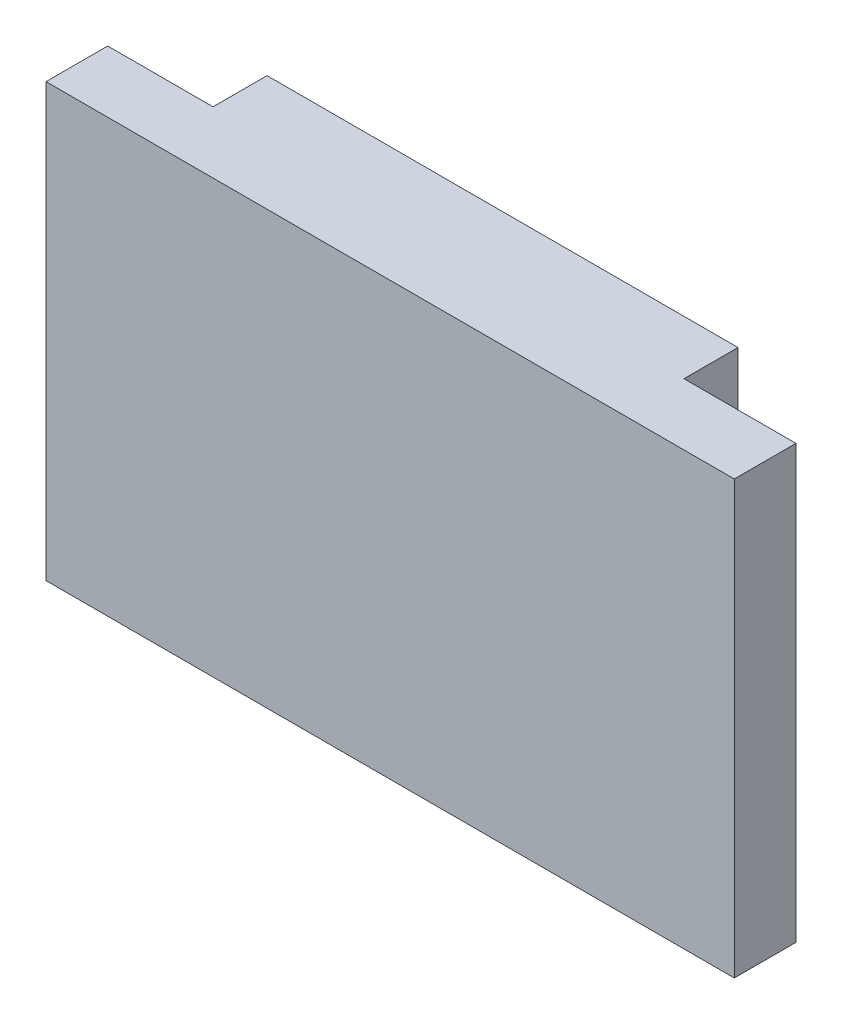
ISO-10303-21;
HEADER;
FILE_DESCRIPTION(('STEP AP214'),'2;1');
FILE_NAME('part.step','',(''),(''),'','','');
FILE_SCHEMA(('AUTOMOTIVE_DESIGN { 1 0 10303 214 1 1 1 1 }'));
ENDSEC;
DATA;
#1=APPLICATION_CONTEXT('core data for automotive mechanical design processes');
#2=APPLICATION_PROTOCOL_DEFINITION('international standard','automotive_design',2000,#1);
#3=PRODUCT_CONTEXT('',#1,'mechanical');
#4=PRODUCT('Part','Part','',(#3));
#5=PRODUCT_RELATED_PRODUCT_CATEGORY('part','',(#4));
#6=PRODUCT_DEFINITION_FORMATION('','',#4);
#7=PRODUCT_DEFINITION_CONTEXT('part definition',#1,'design');
#8=PRODUCT_DEFINITION('design','',#6,#7);
#9=PRODUCT_DEFINITION_SHAPE('','',#8);
#10=(LENGTH_UNIT() NAMED_UNIT(*) SI_UNIT(.MILLI.,.METRE.));
#11=(NAMED_UNIT(*) PLANE_ANGLE_UNIT() SI_UNIT($,.RADIAN.));
#12=(NAMED_UNIT(*) SI_UNIT($,.STERADIAN.) SOLID_ANGLE_UNIT());
#13=UNCERTAINTY_MEASURE_WITH_UNIT(LENGTH_MEASURE(1.E-05),#10,'distance_accuracy_value','');
#14=(GEOMETRIC_REPRESENTATION_CONTEXT(3) GLOBAL_UNCERTAINTY_ASSIGNED_CONTEXT((#13)) GLOBAL_UNIT_ASSIGNED_CONTEXT((#10,
#11,#12)) REPRESENTATION_CONTEXT('',''));
#15=CARTESIAN_POINT('',(0.,0.,0.));
#16=DIRECTION('',(0.,0.,1.));
#17=DIRECTION('',(1.,0.,0.));
#18=AXIS2_PLACEMENT_3D('',#15,#16,#17);
#19=CARTESIAN_POINT('',(-11.4740978759915,0.0459270095103054,-0.177));
#20=DIRECTION('',(0.,0.,-1.));
#21=DIRECTION('',(-1.,0.,0.));
#22=AXIS2_PLACEMENT_3D('',#19,#20,#21);
#23=PLANE('',#22);
#24=DIRECTION('',(0.,1.,0.));
#25=VECTOR('',#24,1.);
#26=CARTESIAN_POINT('',(-10.4866671715199,0.66594163789944,-0.177));
#27=LINE('',#26,#25);
#28=CARTESIAN_POINT('',(-10.4866671715199,-0.574087618878829,-0.177));
#29=VERTEX_POINT('',#28);
#30=CARTESIAN_POINT('',(-10.4866671715199,0.66594163789944,-0.177));
#31=VERTEX_POINT('',#30);
#32=EDGE_CURVE('E127',#29,#31,#27,.T.);
#33=ORIENTED_EDGE('',*,*,#32,.F.);
#34=DIRECTION('',(1.,0.,0.));
#35=VECTOR('',#34,1.);
#36=CARTESIAN_POINT('',(-10.4866671715199,-0.574087618878829,-0.177));
#37=LINE('',#36,#35);
#38=CARTESIAN_POINT('',(-10.8079477063936,-0.574087618878829,-0.177));
#39=VERTEX_POINT('',#38);
#40=EDGE_CURVE('E126',#39,#29,#37,.T.);
#41=ORIENTED_EDGE('',*,*,#40,.F.);
#42=DIRECTION('',(0.,1.,0.));
#43=VECTOR('',#42,1.);
#44=CARTESIAN_POINT('',(-10.8079477063936,0.66594163789944,-0.177));
#45=LINE('',#44,#43);
#46=CARTESIAN_POINT('',(-10.8079477063936,0.66594163789944,-0.177));
#47=VERTEX_POINT('',#46);
#48=EDGE_CURVE('E19',#47,#39,#45,.F.);
#49=ORIENTED_EDGE('',*,*,#48,.F.);
#50=DIRECTION('',(1.,0.,0.));
#51=VECTOR('',#50,1.);
#52=CARTESIAN_POINT('',(-12.4615285804631,0.66594163789944,-0.177));
#53=LINE('',#52,#51);
#54=EDGE_CURVE('E265',#31,#47,#53,.F.);
#55=ORIENTED_EDGE('',*,*,#54,.F.);
#56=EDGE_LOOP('',(#33,#41,#49,#55));
#57=FACE_BOUND('',#56,.T.);
#58=ADVANCED_FACE('F16',(#57),#23,.T.);
#59=CARTESIAN_POINT('',(-10.8079477063936,0.66594163789944,-0.177));
#60=DIRECTION('',(1.,0.,0.));
#61=DIRECTION('',(0.,0.,-1.));
#62=AXIS2_PLACEMENT_3D('',#59,#60,#61);
#63=PLANE('',#62);
#64=DIRECTION('',(0.,1.,0.));
#65=VECTOR('',#64,1.);
#66=CARTESIAN_POINT('',(-10.8079477063936,0.0459270095103054,-0.332));
#67=LINE('',#66,#65);
#68=CARTESIAN_POINT('',(-10.8079477063936,0.66594163789944,-0.332));
#69=VERTEX_POINT('',#68);
#70=CARTESIAN_POINT('',(-10.8079477063936,-0.574087618878829,-0.332));
#71=VERTEX_POINT('',#70);
#72=EDGE_CURVE('E108',#69,#71,#67,.F.);
#73=ORIENTED_EDGE('',*,*,#72,.F.);
#74=DIRECTION('',(0.,0.,1.));
#75=VECTOR('',#74,1.);
#76=CARTESIAN_POINT('',(-10.8079477063936,0.66594163789944,0.));
#77=LINE('',#76,#75);
#78=EDGE_CURVE('E121',#47,#69,#77,.F.);
#79=ORIENTED_EDGE('',*,*,#78,.F.);
#80=ORIENTED_EDGE('',*,*,#48,.T.);
#81=DIRECTION('',(0.,0.,-1.));
#82=VECTOR('',#81,1.);
#83=CARTESIAN_POINT('',(-10.8079477063936,-0.574087618878829,0.));
#84=LINE('',#83,#82);
#85=EDGE_CURVE('E118',#71,#39,#84,.F.);
#86=ORIENTED_EDGE('',*,*,#85,.F.);
#87=EDGE_LOOP('',(#73,#79,#80,#86));
#88=FACE_BOUND('',#87,.T.);
#89=ADVANCED_FACE('F116',(#88),#63,.T.);
#90=CARTESIAN_POINT('',(-11.4836499050464,0.0459270095103054,-0.332));
#91=DIRECTION('',(0.,0.,-1.));
#92=DIRECTION('',(-1.,0.,0.));
#93=AXIS2_PLACEMENT_3D('',#90,#91,#92);
#94=PLANE('',#93);
#95=DIRECTION('',(1.,0.,0.));
#96=VECTOR('',#95,1.);
#97=CARTESIAN_POINT('',(-10.4866671715199,-0.574087618878829,-0.332));
#98=LINE('',#97,#96);
#99=CARTESIAN_POINT('',(-12.1593521036992,-0.574087618878829,-0.332));
#100=VERTEX_POINT('',#99);
#101=EDGE_CURVE('E131',#100,#71,#98,.T.);
#102=ORIENTED_EDGE('',*,*,#101,.F.);
#103=DIRECTION('',(0.,1.,0.));
#104=VECTOR('',#103,1.);
#105=CARTESIAN_POINT('',(-12.1593521036992,-0.574087618878829,-0.332));
#106=LINE('',#105,#104);
#107=CARTESIAN_POINT('',(-12.1593521036992,0.66594163789944,-0.332));
#108=VERTEX_POINT('',#107);
#109=EDGE_CURVE('E107',#108,#100,#106,.F.);
#110=ORIENTED_EDGE('',*,*,#109,.F.);
#111=DIRECTION('',(1.,0.,0.));
#112=VECTOR('',#111,1.);
#113=CARTESIAN_POINT('',(-12.4615285804631,0.66594163789944,-0.332));
#114=LINE('',#113,#112);
#115=EDGE_CURVE('E270',#69,#108,#114,.F.);
#116=ORIENTED_EDGE('',*,*,#115,.F.);
#117=ORIENTED_EDGE('',*,*,#72,.T.);
#118=EDGE_LOOP('',(#102,#110,#116,#117));
#119=FACE_BOUND('',#118,.T.);
#120=ADVANCED_FACE('F141',(#119),#94,.T.);
#121=CARTESIAN_POINT('',(-12.1593521036992,-0.574087618878829,-0.177));
#122=DIRECTION('',(-1.,0.,0.));
#123=DIRECTION('',(0.,0.,1.));
#124=AXIS2_PLACEMENT_3D('',#121,#122,#123);
#125=PLANE('',#124);
#126=ORIENTED_EDGE('',*,*,#109,.T.);
#127=DIRECTION('',(0.,0.,-1.));
#128=VECTOR('',#127,1.);
#129=CARTESIAN_POINT('',(-12.1593521036992,-0.574087618878829,0.));
#130=LINE('',#129,#128);
#131=CARTESIAN_POINT('',(-12.1593521036992,-0.574087618878829,-0.177));
#132=VERTEX_POINT('',#131);
#133=EDGE_CURVE('E97',#132,#100,#130,.T.);
#134=ORIENTED_EDGE('',*,*,#133,.F.);
#135=DIRECTION('',(0.,1.,0.));
#136=VECTOR('',#135,1.);
#137=CARTESIAN_POINT('',(-12.1593521036992,0.0459270095103054,-0.177));
#138=LINE('',#137,#136);
#139=CARTESIAN_POINT('',(-12.1593521036992,0.66594163789944,-0.177));
#140=VERTEX_POINT('',#139);
#141=EDGE_CURVE('E78',#140,#132,#138,.F.);
#142=ORIENTED_EDGE('',*,*,#141,.F.);
#143=DIRECTION('',(0.,0.,1.));
#144=VECTOR('',#143,1.);
#145=CARTESIAN_POINT('',(-12.1593521036992,0.66594163789944,0.));
#146=LINE('',#145,#144);
#147=EDGE_CURVE('E139',#108,#140,#146,.T.);
#148=ORIENTED_EDGE('',*,*,#147,.F.);
#149=EDGE_LOOP('',(#126,#134,#142,#148));
#150=FACE_BOUND('',#149,.T.);
#151=ADVANCED_FACE('F136',(#150),#125,.T.);
#152=CARTESIAN_POINT('',(-11.4740978759915,0.0459270095103054,-0.177));
#153=DIRECTION('',(0.,0.,-1.));
#154=DIRECTION('',(-1.,0.,0.));
#155=AXIS2_PLACEMENT_3D('',#152,#153,#154);
#156=PLANE('',#155);
#157=DIRECTION('',(0.,1.,0.));
#158=VECTOR('',#157,1.);
#159=CARTESIAN_POINT('',(-12.4615285804631,-0.574087618878829,-0.177));
#160=LINE('',#159,#158);
#161=CARTESIAN_POINT('',(-12.4615285804631,0.66594163789944,-0.177));
#162=VERTEX_POINT('',#161);
#163=CARTESIAN_POINT('',(-12.4615285804631,-0.574087618878829,-0.177));
#164=VERTEX_POINT('',#163);
#165=EDGE_CURVE('E83',#162,#164,#160,.F.);
#166=ORIENTED_EDGE('',*,*,#165,.F.);
#167=DIRECTION('',(1.,0.,0.));
#168=VECTOR('',#167,1.);
#169=CARTESIAN_POINT('',(-12.4615285804631,0.66594163789944,-0.177));
#170=LINE('',#169,#168);
#171=EDGE_CURVE('E273',#140,#162,#170,.F.);
#172=ORIENTED_EDGE('',*,*,#171,.F.);
#173=ORIENTED_EDGE('',*,*,#141,.T.);
#174=DIRECTION('',(1.,0.,0.));
#175=VECTOR('',#174,1.);
#176=CARTESIAN_POINT('',(-10.4866671715199,-0.574087618878829,-0.177));
#177=LINE('',#176,#175);
#178=EDGE_CURVE('E93',#164,#132,#177,.T.);
#179=ORIENTED_EDGE('',*,*,#178,.F.);
#180=EDGE_LOOP('',(#166,#172,#173,#179));
#181=FACE_BOUND('',#180,.T.);
#182=ADVANCED_FACE('F94',(#181),#156,.T.);
#183=CARTESIAN_POINT('',(-12.4615285804631,-0.574087618878829,0.));
#184=DIRECTION('',(-1.,0.,0.));
#185=DIRECTION('',(0.,0.,1.));
#186=AXIS2_PLACEMENT_3D('',#183,#184,#185);
#187=PLANE('',#186);
#188=ORIENTED_EDGE('',*,*,#165,.T.);
#189=DIRECTION('',(0.,0.,-1.));
#190=VECTOR('',#189,1.);
#191=CARTESIAN_POINT('',(-12.4615285804631,-0.574087618878829,0.));
#192=LINE('',#191,#190);
#193=CARTESIAN_POINT('',(-12.4615285804631,-0.574087618878829,0.));
#194=VERTEX_POINT('',#193);
#195=EDGE_CURVE('E86',#194,#164,#192,.T.);
#196=ORIENTED_EDGE('',*,*,#195,.F.);
#197=DIRECTION('',(0.,1.,0.));
#198=VECTOR('',#197,1.);
#199=CARTESIAN_POINT('',(-12.4615285804631,0.0459270095103054,0.));
#200=LINE('',#199,#198);
#201=CARTESIAN_POINT('',(-12.4615285804631,0.66594163789944,0.));
#202=VERTEX_POINT('',#201);
#203=EDGE_CURVE('E276',#202,#194,#200,.F.);
#204=ORIENTED_EDGE('',*,*,#203,.F.);
#205=DIRECTION('',(0.,0.,1.));
#206=VECTOR('',#205,1.);
#207=CARTESIAN_POINT('',(-12.4615285804631,0.66594163789944,0.));
#208=LINE('',#207,#206);
#209=EDGE_CURVE('E89',#162,#202,#208,.T.);
#210=ORIENTED_EDGE('',*,*,#209,.F.);
#211=EDGE_LOOP('',(#188,#196,#204,#210));
#212=FACE_BOUND('',#211,.T.);
#213=ADVANCED_FACE('F84',(#212),#187,.T.);
#214=CARTESIAN_POINT('',(-10.4866671715199,-0.574087618878829,0.));
#215=DIRECTION('',(0.,-1.,0.));
#216=DIRECTION('',(0.,0.,-1.));
#217=AXIS2_PLACEMENT_3D('',#214,#215,#216);
#218=PLANE('',#217);
#219=ORIENTED_EDGE('',*,*,#40,.T.);
#220=DIRECTION('',(0.,0.,-1.));
#221=VECTOR('',#220,1.);
#222=CARTESIAN_POINT('',(-10.4866671715199,-0.574087618878829,0.));
#223=LINE('',#222,#221);
#224=CARTESIAN_POINT('',(-10.4866671715199,-0.574087618878829,0.));
#225=VERTEX_POINT('',#224);
#226=EDGE_CURVE('E129',#225,#29,#223,.T.);
#227=ORIENTED_EDGE('',*,*,#226,.F.);
#228=DIRECTION('',(1.,0.,0.));
#229=VECTOR('',#228,1.);
#230=CARTESIAN_POINT('',(-11.4740978759915,-0.574087618878829,0.));
#231=LINE('',#230,#229);
#232=EDGE_CURVE('E101',#194,#225,#231,.T.);
#233=ORIENTED_EDGE('',*,*,#232,.F.);
#234=ORIENTED_EDGE('',*,*,#195,.T.);
#235=ORIENTED_EDGE('',*,*,#178,.T.);
#236=ORIENTED_EDGE('',*,*,#133,.T.);
#237=ORIENTED_EDGE('',*,*,#101,.T.);
#238=ORIENTED_EDGE('',*,*,#85,.T.);
#239=EDGE_LOOP('',(#219,#227,#233,#234,#235,#236,#237,#238));
#240=FACE_BOUND('',#239,.T.);
#241=ADVANCED_FACE('F99',(#240),#218,.T.);
#242=CARTESIAN_POINT('',(-10.4866671715199,0.66594163789944,0.));
#243=DIRECTION('',(1.,0.,0.));
#244=DIRECTION('',(0.,0.,-1.));
#245=AXIS2_PLACEMENT_3D('',#242,#243,#244);
#246=PLANE('',#245);
#247=ORIENTED_EDGE('',*,*,#32,.T.);
#248=DIRECTION('',(0.,0.,1.));
#249=VECTOR('',#248,1.);
#250=CARTESIAN_POINT('',(-10.4866671715199,0.66594163789944,0.));
#251=LINE('',#250,#249);
#252=CARTESIAN_POINT('',(-10.4866671715199,0.66594163789944,0.));
#253=VERTEX_POINT('',#252);
#254=EDGE_CURVE('E34',#253,#31,#251,.F.);
#255=ORIENTED_EDGE('',*,*,#254,.F.);
#256=DIRECTION('',(0.,1.,0.));
#257=VECTOR('',#256,1.);
#258=CARTESIAN_POINT('',(-10.4866671715199,0.0459270095103054,0.));
#259=LINE('',#258,#257);
#260=EDGE_CURVE('E25',#225,#253,#259,.T.);
#261=ORIENTED_EDGE('',*,*,#260,.F.);
#262=ORIENTED_EDGE('',*,*,#226,.T.);
#263=EDGE_LOOP('',(#247,#255,#261,#262));
#264=FACE_BOUND('',#263,.T.);
#265=ADVANCED_FACE('F158',(#264),#246,.T.);
#266=CARTESIAN_POINT('',(-12.4615285804631,0.66594163789944,0.));
#267=DIRECTION('',(0.,1.,0.));
#268=DIRECTION('',(0.,0.,1.));
#269=AXIS2_PLACEMENT_3D('',#266,#267,#268);
#270=PLANE('',#269);
#271=ORIENTED_EDGE('',*,*,#171,.T.);
#272=ORIENTED_EDGE('',*,*,#209,.T.);
#273=DIRECTION('',(1.,0.,0.));
#274=VECTOR('',#273,1.);
#275=CARTESIAN_POINT('',(-11.4740978759915,0.66594163789944,0.));
#276=LINE('',#275,#274);
#277=EDGE_CURVE('E11',#253,#202,#276,.F.);
#278=ORIENTED_EDGE('',*,*,#277,.F.);
#279=ORIENTED_EDGE('',*,*,#254,.T.);
#280=ORIENTED_EDGE('',*,*,#54,.T.);
#281=ORIENTED_EDGE('',*,*,#78,.T.);
#282=ORIENTED_EDGE('',*,*,#115,.T.);
#283=ORIENTED_EDGE('',*,*,#147,.T.);
#284=EDGE_LOOP('',(#271,#272,#278,#279,#280,#281,#282,#283));
#285=FACE_BOUND('',#284,.T.);
#286=ADVANCED_FACE('F152',(#285),#270,.T.);
#287=CARTESIAN_POINT('',(-11.4740978759915,0.0459270095103054,0.));
#288=DIRECTION('',(0.,0.,1.));
#289=DIRECTION('',(1.,0.,0.));
#290=AXIS2_PLACEMENT_3D('',#287,#288,#289);
#291=PLANE('',#290);
#292=ORIENTED_EDGE('',*,*,#260,.T.);
#293=ORIENTED_EDGE('',*,*,#277,.T.);
#294=ORIENTED_EDGE('',*,*,#203,.T.);
#295=ORIENTED_EDGE('',*,*,#232,.T.);
#296=EDGE_LOOP('',(#292,#293,#294,#295));
#297=FACE_BOUND('',#296,.T.);
#298=ADVANCED_FACE('F150',(#297),#291,.T.);
#299=CLOSED_SHELL('',(#58,#89,#120,#151,#182,#213,#241,#265,#286,#298));
#300=MANIFOLD_SOLID_BREP('B1',#299);
#301=ADVANCED_BREP_SHAPE_REPRESENTATION('',(#18,#300),#14);
#302=SHAPE_DEFINITION_REPRESENTATION(#9,#301);
ENDSEC;
END-ISO-10303-21;
